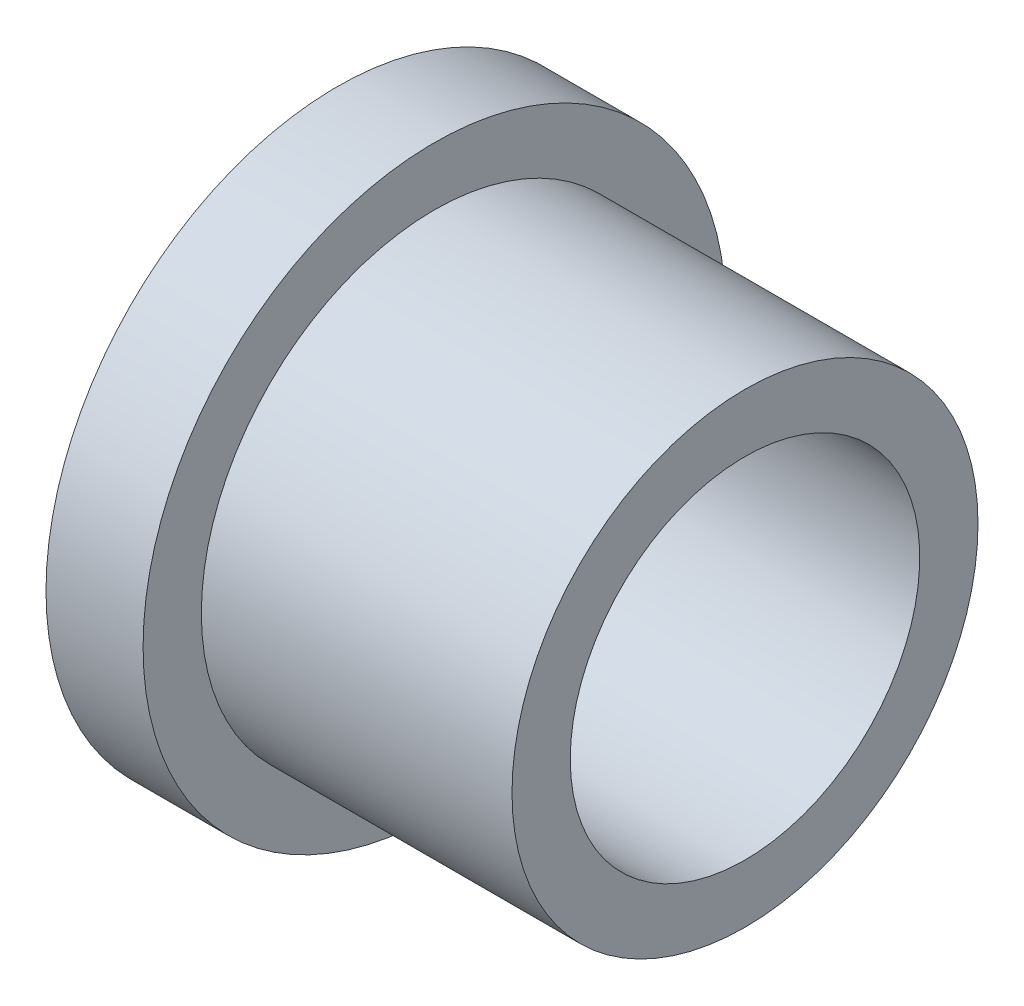
ISO-10303-21;
HEADER;
FILE_DESCRIPTION(('STEP AP214'),'2;1');
FILE_NAME('part.step','',(''),(''),'','','');
FILE_SCHEMA(('AUTOMOTIVE_DESIGN { 1 0 10303 214 1 1 1 1 }'));
ENDSEC;
DATA;
#1=APPLICATION_CONTEXT('core data for automotive mechanical design processes');
#2=APPLICATION_PROTOCOL_DEFINITION('international standard','automotive_design',2000,#1);
#3=PRODUCT_CONTEXT('',#1,'mechanical');
#4=PRODUCT('Part','Part','',(#3));
#5=PRODUCT_RELATED_PRODUCT_CATEGORY('part','',(#4));
#6=PRODUCT_DEFINITION_FORMATION('','',#4);
#7=PRODUCT_DEFINITION_CONTEXT('part definition',#1,'design');
#8=PRODUCT_DEFINITION('design','',#6,#7);
#9=PRODUCT_DEFINITION_SHAPE('','',#8);
#10=(LENGTH_UNIT() NAMED_UNIT(*) SI_UNIT(.MILLI.,.METRE.));
#11=(NAMED_UNIT(*) PLANE_ANGLE_UNIT() SI_UNIT($,.RADIAN.));
#12=(NAMED_UNIT(*) SI_UNIT($,.STERADIAN.) SOLID_ANGLE_UNIT());
#13=UNCERTAINTY_MEASURE_WITH_UNIT(LENGTH_MEASURE(1.E-05),#10,'distance_accuracy_value','');
#14=(GEOMETRIC_REPRESENTATION_CONTEXT(3) GLOBAL_UNCERTAINTY_ASSIGNED_CONTEXT((#13)) GLOBAL_UNIT_ASSIGNED_CONTEXT((#10,
#11,#12)) REPRESENTATION_CONTEXT('',''));
#15=CARTESIAN_POINT('',(0.,0.,0.));
#16=DIRECTION('',(0.,0.,1.));
#17=DIRECTION('',(1.,0.,0.));
#18=AXIS2_PLACEMENT_3D('',#15,#16,#17);
#19=CARTESIAN_POINT('',(-10.5,15.,0.));
#20=DIRECTION('',(1.,0.,0.));
#21=DIRECTION('',(0.,0.,-1.));
#22=AXIS2_PLACEMENT_3D('',#19,#20,#21);
#23=PLANE('',#22);
#24=CARTESIAN_POINT('',(-10.5,0.,0.));
#25=DIRECTION('',(1.,0.,0.));
#26=DIRECTION('',(0.,0.,-1.));
#27=AXIS2_PLACEMENT_3D('',#24,#25,#26);
#28=CIRCLE('',#27,12.);
#29=CARTESIAN_POINT('',(-10.5,0.,-12.));
#30=VERTEX_POINT('',#29);
#31=EDGE_CURVE('E67',#30,#30,#28,.F.);
#32=ORIENTED_EDGE('',*,*,#31,.F.);
#33=EDGE_LOOP('',(#32));
#34=FACE_BOUND('',#33,.T.);
#35=CARTESIAN_POINT('',(-10.5,0.,0.));
#36=DIRECTION('',(-1.,0.,0.));
#37=DIRECTION('',(0.,0.,1.));
#38=AXIS2_PLACEMENT_3D('',#35,#36,#37);
#39=CIRCLE('',#38,15.);
#40=CARTESIAN_POINT('',(-10.5,0.,15.));
#41=VERTEX_POINT('',#40);
#42=EDGE_CURVE('E60',#41,#41,#39,.T.);
#43=ORIENTED_EDGE('',*,*,#42,.T.);
#44=EDGE_LOOP('',(#43));
#45=FACE_BOUND('',#44,.T.);
#46=ADVANCED_FACE('F41',(#34,#45),#23,.F.);
#47=CARTESIAN_POINT('',(10.5,12.,0.));
#48=DIRECTION('',(-1.,0.,0.));
#49=DIRECTION('',(0.,0.,1.));
#50=AXIS2_PLACEMENT_3D('',#47,#48,#49);
#51=PLANE('',#50);
#52=CARTESIAN_POINT('',(10.5,0.,0.));
#53=DIRECTION('',(-1.,0.,0.));
#54=DIRECTION('',(0.,0.,1.));
#55=AXIS2_PLACEMENT_3D('',#52,#53,#54);
#56=CIRCLE('',#55,9.);
#57=CARTESIAN_POINT('',(10.5,0.,8.99999999999997));
#58=VERTEX_POINT('',#57);
#59=EDGE_CURVE('E66',#58,#58,#56,.T.);
#60=ORIENTED_EDGE('',*,*,#59,.T.);
#61=EDGE_LOOP('',(#60));
#62=FACE_BOUND('',#61,.T.);
#63=CARTESIAN_POINT('',(10.5,0.,0.));
#64=DIRECTION('',(-1.,0.,0.));
#65=DIRECTION('',(0.,0.,1.));
#66=AXIS2_PLACEMENT_3D('',#63,#64,#65);
#67=CIRCLE('',#66,12.);
#68=CARTESIAN_POINT('',(10.5,0.,12.));
#69=VERTEX_POINT('',#68);
#70=EDGE_CURVE('E10',#69,#69,#67,.T.);
#71=ORIENTED_EDGE('',*,*,#70,.F.);
#72=EDGE_LOOP('',(#71));
#73=FACE_BOUND('',#72,.T.);
#74=ADVANCED_FACE('F101',(#62,#73),#51,.F.);
#75=CARTESIAN_POINT('',(-10.5,0.,0.));
#76=DIRECTION('',(-1.,0.,0.));
#77=DIRECTION('',(0.,0.,1.));
#78=AXIS2_PLACEMENT_3D('',#75,#76,#77);
#79=CYLINDRICAL_SURFACE('',#78,12.);
#80=CARTESIAN_POINT('',(-5.50000000000001,0.,0.));
#81=DIRECTION('',(-1.,0.,0.));
#82=DIRECTION('',(0.,0.,1.));
#83=AXIS2_PLACEMENT_3D('',#80,#81,#82);
#84=CIRCLE('',#83,12.);
#85=CARTESIAN_POINT('',(-5.50000000000001,0.,12.));
#86=VERTEX_POINT('',#85);
#87=EDGE_CURVE('E48',#86,#86,#84,.T.);
#88=ORIENTED_EDGE('',*,*,#87,.F.);
#89=EDGE_LOOP('',(#88));
#90=FACE_BOUND('',#89,.T.);
#91=ORIENTED_EDGE('',*,*,#70,.T.);
#92=EDGE_LOOP('',(#91));
#93=FACE_BOUND('',#92,.T.);
#94=ADVANCED_FACE('F106',(#90,#93),#79,.T.);
#95=CARTESIAN_POINT('',(-5.50000000000001,15.,0.));
#96=DIRECTION('',(-1.,0.,0.));
#97=DIRECTION('',(0.,0.,1.));
#98=AXIS2_PLACEMENT_3D('',#95,#96,#97);
#99=PLANE('',#98);
#100=CARTESIAN_POINT('',(-5.50000000000001,0.,0.));
#101=DIRECTION('',(-1.,0.,0.));
#102=DIRECTION('',(0.,0.,1.));
#103=AXIS2_PLACEMENT_3D('',#100,#101,#102);
#104=CIRCLE('',#103,15.);
#105=CARTESIAN_POINT('',(-5.50000000000001,0.,15.));
#106=VERTEX_POINT('',#105);
#107=EDGE_CURVE('E54',#106,#106,#104,.T.);
#108=ORIENTED_EDGE('',*,*,#107,.F.);
#109=EDGE_LOOP('',(#108));
#110=FACE_BOUND('',#109,.T.);
#111=ORIENTED_EDGE('',*,*,#87,.T.);
#112=EDGE_LOOP('',(#111));
#113=FACE_BOUND('',#112,.T.);
#114=ADVANCED_FACE('F114',(#110,#113),#99,.F.);
#115=CARTESIAN_POINT('',(-10.5,0.,0.));
#116=DIRECTION('',(-1.,0.,0.));
#117=DIRECTION('',(0.,0.,1.));
#118=AXIS2_PLACEMENT_3D('',#115,#116,#117);
#119=CYLINDRICAL_SURFACE('',#118,15.);
#120=ORIENTED_EDGE('',*,*,#42,.F.);
#121=EDGE_LOOP('',(#120));
#122=FACE_BOUND('',#121,.T.);
#123=ORIENTED_EDGE('',*,*,#107,.T.);
#124=EDGE_LOOP('',(#123));
#125=FACE_BOUND('',#124,.T.);
#126=ADVANCED_FACE('F98',(#122,#125),#119,.T.);
#127=CARTESIAN_POINT('',(-10.5,0.,0.));
#128=DIRECTION('',(-1.,0.,0.));
#129=DIRECTION('',(0.,0.,1.));
#130=AXIS2_PLACEMENT_3D('',#127,#128,#129);
#131=CYLINDRICAL_SURFACE('',#130,9.);
#132=CARTESIAN_POINT('',(-8.50000000000001,0.,0.));
#133=DIRECTION('',(-1.,0.,0.));
#134=DIRECTION('',(0.,0.,1.));
#135=AXIS2_PLACEMENT_3D('',#132,#133,#134);
#136=CIRCLE('',#135,9.);
#137=CARTESIAN_POINT('',(-8.50000000000001,0.,8.99999999999997));
#138=VERTEX_POINT('',#137);
#139=EDGE_CURVE('E75',#138,#138,#136,.T.);
#140=ORIENTED_EDGE('',*,*,#139,.T.);
#141=EDGE_LOOP('',(#140));
#142=FACE_BOUND('',#141,.T.);
#143=ORIENTED_EDGE('',*,*,#59,.F.);
#144=EDGE_LOOP('',(#143));
#145=FACE_BOUND('',#144,.T.);
#146=ADVANCED_FACE('F84',(#142,#145),#131,.F.);
#147=CARTESIAN_POINT('',(-8.50000000000001,15.,0.));
#148=DIRECTION('',(-1.,0.,0.));
#149=DIRECTION('',(0.,0.,1.));
#150=AXIS2_PLACEMENT_3D('',#147,#148,#149);
#151=PLANE('',#150);
#152=CARTESIAN_POINT('',(-8.50000000000001,0.,0.));
#153=DIRECTION('',(-1.,0.,0.));
#154=DIRECTION('',(0.,0.,1.));
#155=AXIS2_PLACEMENT_3D('',#152,#153,#154);
#156=CIRCLE('',#155,12.);
#157=CARTESIAN_POINT('',(-8.50000000000001,0.,12.));
#158=VERTEX_POINT('',#157);
#159=EDGE_CURVE('E71',#158,#158,#156,.T.);
#160=ORIENTED_EDGE('',*,*,#159,.T.);
#161=EDGE_LOOP('',(#160));
#162=FACE_BOUND('',#161,.T.);
#163=ORIENTED_EDGE('',*,*,#139,.F.);
#164=EDGE_LOOP('',(#163));
#165=FACE_BOUND('',#164,.T.);
#166=ADVANCED_FACE('F87',(#162,#165),#151,.T.);
#167=CARTESIAN_POINT('',(-10.5,0.,0.));
#168=DIRECTION('',(-1.,0.,0.));
#169=DIRECTION('',(0.,0.,1.));
#170=AXIS2_PLACEMENT_3D('',#167,#168,#169);
#171=CYLINDRICAL_SURFACE('',#170,12.);
#172=ORIENTED_EDGE('',*,*,#31,.T.);
#173=EDGE_LOOP('',(#172));
#174=FACE_BOUND('',#173,.T.);
#175=ORIENTED_EDGE('',*,*,#159,.F.);
#176=EDGE_LOOP('',(#175));
#177=FACE_BOUND('',#176,.T.);
#178=ADVANCED_FACE('F89',(#174,#177),#171,.F.);
#179=CLOSED_SHELL('',(#46,#74,#94,#114,#126,#146,#166,#178));
#180=MANIFOLD_SOLID_BREP('B2',#179);
#181=ADVANCED_BREP_SHAPE_REPRESENTATION('',(#18,#180),#14);
#182=SHAPE_DEFINITION_REPRESENTATION(#9,#181);
ENDSEC;
END-ISO-10303-21;
